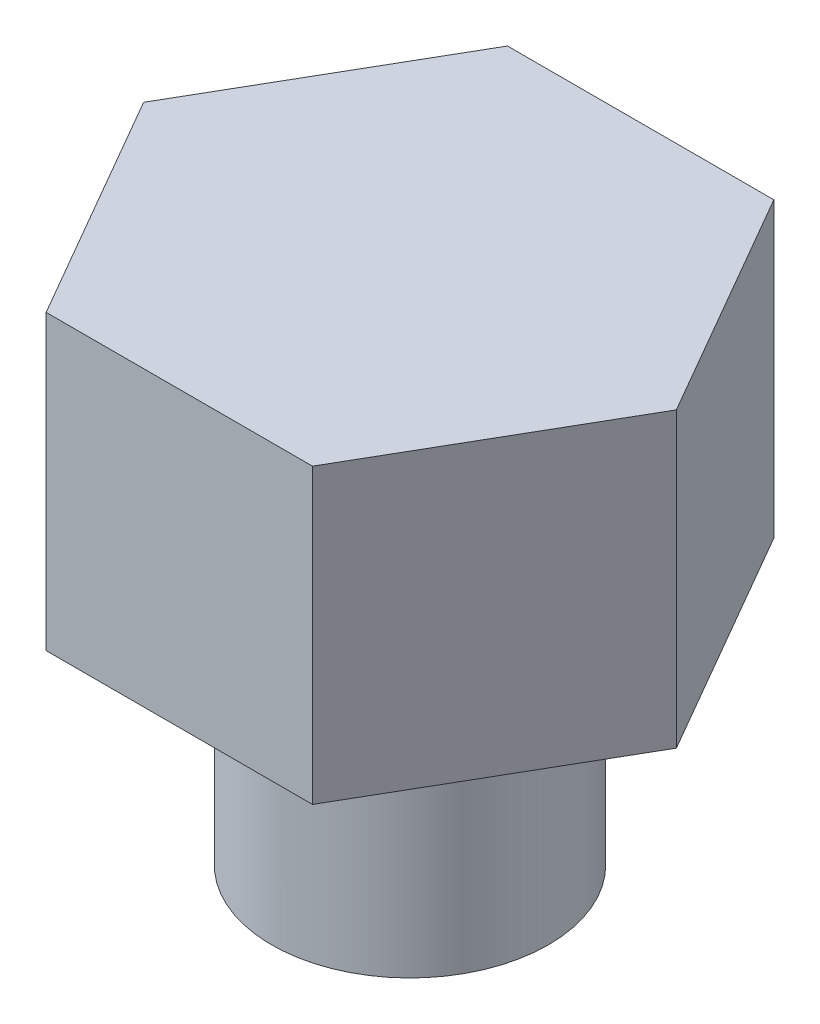
ISO-10303-21;
HEADER;
FILE_DESCRIPTION(('STEP AP214'),'2;1');
FILE_NAME('part.step','',(''),(''),'','','');
FILE_SCHEMA(('AUTOMOTIVE_DESIGN { 1 0 10303 214 1 1 1 1 }'));
ENDSEC;
DATA;
#1=APPLICATION_CONTEXT('core data for automotive mechanical design processes');
#2=APPLICATION_PROTOCOL_DEFINITION('international standard','automotive_design',2000,#1);
#3=PRODUCT_CONTEXT('',#1,'mechanical');
#4=PRODUCT('Part','Part','',(#3));
#5=PRODUCT_RELATED_PRODUCT_CATEGORY('part','',(#4));
#6=PRODUCT_DEFINITION_FORMATION('','',#4);
#7=PRODUCT_DEFINITION_CONTEXT('part definition',#1,'design');
#8=PRODUCT_DEFINITION('design','',#6,#7);
#9=PRODUCT_DEFINITION_SHAPE('','',#8);
#10=(LENGTH_UNIT() NAMED_UNIT(*) SI_UNIT(.MILLI.,.METRE.));
#11=(NAMED_UNIT(*) PLANE_ANGLE_UNIT() SI_UNIT($,.RADIAN.));
#12=(NAMED_UNIT(*) SI_UNIT($,.STERADIAN.) SOLID_ANGLE_UNIT());
#13=UNCERTAINTY_MEASURE_WITH_UNIT(LENGTH_MEASURE(1.E-05),#10,'distance_accuracy_value','');
#14=(GEOMETRIC_REPRESENTATION_CONTEXT(3) GLOBAL_UNCERTAINTY_ASSIGNED_CONTEXT((#13)) GLOBAL_UNIT_ASSIGNED_CONTEXT((#10,
#11,#12)) REPRESENTATION_CONTEXT('',''));
#15=CARTESIAN_POINT('',(0.,0.,0.));
#16=DIRECTION('',(0.,0.,1.));
#17=DIRECTION('',(1.,0.,0.));
#18=AXIS2_PLACEMENT_3D('',#15,#16,#17);
#19=CARTESIAN_POINT('',(5.77350269189626,-11.9252523165195,0.));
#20=DIRECTION('',(-0.866025403784439,0.,-0.5));
#21=DIRECTION('',(-0.5,0.,0.866025403784439));
#22=AXIS2_PLACEMENT_3D('',#19,#20,#21);
#23=PLANE('',#22);
#24=DIRECTION('',(-0.5,0.,0.866025403784439));
#25=VECTOR('',#24,1.);
#26=CARTESIAN_POINT('',(5.77350269189626,3.35,0.));
#27=LINE('',#26,#25);
#28=CARTESIAN_POINT('',(5.77350269189626,3.35,0.));
#29=VERTEX_POINT('',#28);
#30=CARTESIAN_POINT('',(2.88675134594813,3.35,5.));
#31=VERTEX_POINT('',#30);
#32=EDGE_CURVE('E288',#29,#31,#27,.T.);
#33=ORIENTED_EDGE('',*,*,#32,.F.);
#34=DIRECTION('',(0.,1.,0.));
#35=VECTOR('',#34,1.);
#36=CARTESIAN_POINT('',(5.77350269189626,-11.9252523165195,0.));
#37=LINE('',#36,#35);
#38=CARTESIAN_POINT('',(5.77350269189626,9.7,0.));
#39=VERTEX_POINT('',#38);
#40=EDGE_CURVE('E49',#29,#39,#37,.T.);
#41=ORIENTED_EDGE('',*,*,#40,.T.);
#42=DIRECTION('',(-0.5,0.,0.866025403784439));
#43=VECTOR('',#42,1.);
#44=CARTESIAN_POINT('',(5.77350269189626,9.7,0.));
#45=LINE('',#44,#43);
#46=CARTESIAN_POINT('',(2.88675134594813,9.7,5.));
#47=VERTEX_POINT('',#46);
#48=EDGE_CURVE('E260',#39,#47,#45,.T.);
#49=ORIENTED_EDGE('',*,*,#48,.T.);
#50=DIRECTION('',(0.,1.,0.));
#51=VECTOR('',#50,1.);
#52=CARTESIAN_POINT('',(2.88675134594813,-11.9252523165195,5.));
#53=LINE('',#52,#51);
#54=EDGE_CURVE('E269',#31,#47,#53,.T.);
#55=ORIENTED_EDGE('',*,*,#54,.F.);
#56=EDGE_LOOP('',(#33,#41,#49,#55));
#57=FACE_BOUND('',#56,.T.);
#58=ADVANCED_FACE('F45',(#57),#23,.F.);
#59=CARTESIAN_POINT('',(2.88675134594813,-11.9252523165195,5.));
#60=DIRECTION('',(0.,0.,-1.));
#61=DIRECTION('',(-1.,0.,0.));
#62=AXIS2_PLACEMENT_3D('',#59,#60,#61);
#63=PLANE('',#62);
#64=DIRECTION('',(-1.,0.,0.));
#65=VECTOR('',#64,1.);
#66=CARTESIAN_POINT('',(2.88675134594813,3.35,5.));
#67=LINE('',#66,#65);
#68=CARTESIAN_POINT('',(-2.88675134594813,3.35,5.));
#69=VERTEX_POINT('',#68);
#70=EDGE_CURVE('E284',#31,#69,#67,.T.);
#71=ORIENTED_EDGE('',*,*,#70,.F.);
#72=ORIENTED_EDGE('',*,*,#54,.T.);
#73=DIRECTION('',(-1.,0.,0.));
#74=VECTOR('',#73,1.);
#75=CARTESIAN_POINT('',(2.88675134594813,9.7,5.));
#76=LINE('',#75,#74);
#77=CARTESIAN_POINT('',(-2.88675134594813,9.7,5.));
#78=VERTEX_POINT('',#77);
#79=EDGE_CURVE('E266',#47,#78,#76,.T.);
#80=ORIENTED_EDGE('',*,*,#79,.T.);
#81=DIRECTION('',(0.,1.,0.));
#82=VECTOR('',#81,1.);
#83=CARTESIAN_POINT('',(-2.88675134594813,-11.9252523165195,5.));
#84=LINE('',#83,#82);
#85=EDGE_CURVE('E296',#69,#78,#84,.T.);
#86=ORIENTED_EDGE('',*,*,#85,.F.);
#87=EDGE_LOOP('',(#71,#72,#80,#86));
#88=FACE_BOUND('',#87,.T.);
#89=ADVANCED_FACE('F224',(#88),#63,.F.);
#90=CARTESIAN_POINT('',(-2.88675134594813,-11.9252523165195,5.));
#91=DIRECTION('',(0.866025403784438,0.,-0.5));
#92=DIRECTION('',(-0.5,0.,-0.866025403784439));
#93=AXIS2_PLACEMENT_3D('',#90,#91,#92);
#94=PLANE('',#93);
#95=DIRECTION('',(-0.5,0.,-0.866025403784439));
#96=VECTOR('',#95,1.);
#97=CARTESIAN_POINT('',(-2.88675134594813,3.35,5.));
#98=LINE('',#97,#96);
#99=CARTESIAN_POINT('',(-5.77350269189626,3.35,0.));
#100=VERTEX_POINT('',#99);
#101=EDGE_CURVE('E280',#69,#100,#98,.T.);
#102=ORIENTED_EDGE('',*,*,#101,.F.);
#103=ORIENTED_EDGE('',*,*,#85,.T.);
#104=DIRECTION('',(-0.5,0.,-0.866025403784439));
#105=VECTOR('',#104,1.);
#106=CARTESIAN_POINT('',(-2.88675134594813,9.7,5.));
#107=LINE('',#106,#105);
#108=CARTESIAN_POINT('',(-5.77350269189626,9.7,0.));
#109=VERTEX_POINT('',#108);
#110=EDGE_CURVE('E299',#78,#109,#107,.T.);
#111=ORIENTED_EDGE('',*,*,#110,.T.);
#112=DIRECTION('',(0.,1.,0.));
#113=VECTOR('',#112,1.);
#114=CARTESIAN_POINT('',(-5.77350269189626,-11.9252523165195,0.));
#115=LINE('',#114,#113);
#116=EDGE_CURVE('E300',#100,#109,#115,.T.);
#117=ORIENTED_EDGE('',*,*,#116,.F.);
#118=EDGE_LOOP('',(#102,#103,#111,#117));
#119=FACE_BOUND('',#118,.T.);
#120=ADVANCED_FACE('F230',(#119),#94,.F.);
#121=CARTESIAN_POINT('',(-5.77350269189626,-11.9252523165195,0.));
#122=DIRECTION('',(0.866025403784439,0.,0.5));
#123=DIRECTION('',(0.5,0.,-0.866025403784439));
#124=AXIS2_PLACEMENT_3D('',#121,#122,#123);
#125=PLANE('',#124);
#126=DIRECTION('',(0.5,0.,-0.866025403784439));
#127=VECTOR('',#126,1.);
#128=CARTESIAN_POINT('',(-5.77350269189626,3.35,0.));
#129=LINE('',#128,#127);
#130=CARTESIAN_POINT('',(-2.88675134594813,3.35,-5.));
#131=VERTEX_POINT('',#130);
#132=EDGE_CURVE('E55',#100,#131,#129,.T.);
#133=ORIENTED_EDGE('',*,*,#132,.F.);
#134=ORIENTED_EDGE('',*,*,#116,.T.);
#135=DIRECTION('',(0.5,0.,-0.866025403784439));
#136=VECTOR('',#135,1.);
#137=CARTESIAN_POINT('',(-5.77350269189626,9.7,0.));
#138=LINE('',#137,#136);
#139=CARTESIAN_POINT('',(-2.88675134594813,9.7,-5.));
#140=VERTEX_POINT('',#139);
#141=EDGE_CURVE('E303',#109,#140,#138,.T.);
#142=ORIENTED_EDGE('',*,*,#141,.T.);
#143=DIRECTION('',(0.,1.,0.));
#144=VECTOR('',#143,1.);
#145=CARTESIAN_POINT('',(-2.88675134594813,-11.9252523165195,-5.));
#146=LINE('',#145,#144);
#147=EDGE_CURVE('E304',#131,#140,#146,.T.);
#148=ORIENTED_EDGE('',*,*,#147,.F.);
#149=EDGE_LOOP('',(#133,#134,#142,#148));
#150=FACE_BOUND('',#149,.T.);
#151=ADVANCED_FACE('F237',(#150),#125,.F.);
#152=CARTESIAN_POINT('',(-2.88675134594813,-11.9252523165195,-5.));
#153=DIRECTION('',(0.,0.,1.));
#154=DIRECTION('',(1.,0.,0.));
#155=AXIS2_PLACEMENT_3D('',#152,#153,#154);
#156=PLANE('',#155);
#157=DIRECTION('',(1.,0.,0.));
#158=VECTOR('',#157,1.);
#159=CARTESIAN_POINT('',(-2.88675134594813,3.35,-5.));
#160=LINE('',#159,#158);
#161=CARTESIAN_POINT('',(2.88675134594813,3.35,-5.));
#162=VERTEX_POINT('',#161);
#163=EDGE_CURVE('E11',#131,#162,#160,.T.);
#164=ORIENTED_EDGE('',*,*,#163,.F.);
#165=ORIENTED_EDGE('',*,*,#147,.T.);
#166=DIRECTION('',(1.,0.,0.));
#167=VECTOR('',#166,1.);
#168=CARTESIAN_POINT('',(-2.88675134594813,9.7,-5.));
#169=LINE('',#168,#167);
#170=CARTESIAN_POINT('',(2.88675134594813,9.7,-5.));
#171=VERTEX_POINT('',#170);
#172=EDGE_CURVE('E306',#140,#171,#169,.T.);
#173=ORIENTED_EDGE('',*,*,#172,.T.);
#174=DIRECTION('',(0.,1.,0.));
#175=VECTOR('',#174,1.);
#176=CARTESIAN_POINT('',(2.88675134594813,-11.9252523165195,-5.));
#177=LINE('',#176,#175);
#178=EDGE_CURVE('E307',#162,#171,#177,.T.);
#179=ORIENTED_EDGE('',*,*,#178,.F.);
#180=EDGE_LOOP('',(#164,#165,#173,#179));
#181=FACE_BOUND('',#180,.T.);
#182=ADVANCED_FACE('F241',(#181),#156,.F.);
#183=CARTESIAN_POINT('',(2.88675134594813,-11.9252523165195,-5.));
#184=DIRECTION('',(-0.866025403784438,0.,0.5));
#185=DIRECTION('',(0.5,0.,0.866025403784438));
#186=AXIS2_PLACEMENT_3D('',#183,#184,#185);
#187=PLANE('',#186);
#188=DIRECTION('',(0.5,0.,0.866025403784438));
#189=VECTOR('',#188,1.);
#190=CARTESIAN_POINT('',(2.88675134594813,3.35,-5.));
#191=LINE('',#190,#189);
#192=EDGE_CURVE('E292',#162,#29,#191,.T.);
#193=ORIENTED_EDGE('',*,*,#192,.F.);
#194=ORIENTED_EDGE('',*,*,#178,.T.);
#195=DIRECTION('',(0.5,0.,0.866025403784438));
#196=VECTOR('',#195,1.);
#197=CARTESIAN_POINT('',(2.88675134594813,9.7,-5.));
#198=LINE('',#197,#196);
#199=EDGE_CURVE('E263',#171,#39,#198,.T.);
#200=ORIENTED_EDGE('',*,*,#199,.T.);
#201=ORIENTED_EDGE('',*,*,#40,.F.);
#202=EDGE_LOOP('',(#193,#194,#200,#201));
#203=FACE_BOUND('',#202,.T.);
#204=ADVANCED_FACE('F245',(#203),#187,.F.);
#205=CARTESIAN_POINT('',(0.,9.7,0.));
#206=DIRECTION('',(0.,-1.,0.));
#207=DIRECTION('',(0.,0.,-1.));
#208=AXIS2_PLACEMENT_3D('',#205,#206,#207);
#209=PLANE('',#208);
#210=ORIENTED_EDGE('',*,*,#48,.F.);
#211=ORIENTED_EDGE('',*,*,#199,.F.);
#212=ORIENTED_EDGE('',*,*,#172,.F.);
#213=ORIENTED_EDGE('',*,*,#141,.F.);
#214=ORIENTED_EDGE('',*,*,#110,.F.);
#215=ORIENTED_EDGE('',*,*,#79,.F.);
#216=EDGE_LOOP('',(#210,#211,#212,#213,#214,#215));
#217=FACE_BOUND('',#216,.T.);
#218=ADVANCED_FACE('F248',(#217),#209,.F.);
#219=CARTESIAN_POINT('',(0.,3.35,0.));
#220=DIRECTION('',(0.,-1.,0.));
#221=DIRECTION('',(1.,0.,0.));
#222=AXIS2_PLACEMENT_3D('',#219,#220,#221);
#223=PLANE('',#222);
#224=DIRECTION('',(1.,0.,0.));
#225=VECTOR('',#224,1.);
#226=CARTESIAN_POINT('',(-19.,3.35,0.442499999999999));
#227=LINE('',#226,#225);
#228=CARTESIAN_POINT('',(-2.96718616706131,3.35,0.442499999999999));
#229=VERTEX_POINT('',#228);
#230=CARTESIAN_POINT('',(0.,3.35,0.442499999999999));
#231=VERTEX_POINT('',#230);
#232=EDGE_CURVE('E63',#229,#231,#227,.T.);
#233=ORIENTED_EDGE('',*,*,#232,.F.);
#234=CARTESIAN_POINT('',(0.,3.35,0.));
#235=DIRECTION('',(0.,-1.,0.));
#236=DIRECTION('',(1.,0.,0.));
#237=AXIS2_PLACEMENT_3D('',#234,#235,#236);
#238=CIRCLE('',#237,3.);
#239=CARTESIAN_POINT('',(-2.96718616706131,3.35,-0.442499999999999));
#240=VERTEX_POINT('',#239);
#241=EDGE_CURVE('E68',#240,#229,#238,.T.);
#242=ORIENTED_EDGE('',*,*,#241,.F.);
#243=DIRECTION('',(1.,0.,0.));
#244=VECTOR('',#243,1.);
#245=CARTESIAN_POINT('',(-19.,3.35,-0.442499999999999));
#246=LINE('',#245,#244);
#247=CARTESIAN_POINT('',(0.,3.35,-0.442499999999999));
#248=VERTEX_POINT('',#247);
#249=EDGE_CURVE('E331',#240,#248,#246,.T.);
#250=ORIENTED_EDGE('',*,*,#249,.T.);
#251=DIRECTION('',(0.,0.,1.));
#252=VECTOR('',#251,1.);
#253=CARTESIAN_POINT('',(0.,3.35,0.442499999999999));
#254=LINE('',#253,#252);
#255=EDGE_CURVE('E168',#248,#231,#254,.T.);
#256=ORIENTED_EDGE('',*,*,#255,.T.);
#257=EDGE_LOOP('',(#233,#242,#250,#256));
#258=FACE_BOUND('',#257,.T.);
#259=ORIENTED_EDGE('',*,*,#192,.T.);
#260=ORIENTED_EDGE('',*,*,#32,.T.);
#261=ORIENTED_EDGE('',*,*,#70,.T.);
#262=ORIENTED_EDGE('',*,*,#101,.T.);
#263=ORIENTED_EDGE('',*,*,#132,.T.);
#264=ORIENTED_EDGE('',*,*,#163,.T.);
#265=EDGE_LOOP('',(#259,#260,#261,#262,#263,#264));
#266=FACE_BOUND('',#265,.T.);
#267=ADVANCED_FACE('F47',(#258,#266),#223,.T.);
#268=CARTESIAN_POINT('',(0.,-1.73,0.));
#269=DIRECTION('',(0.,1.,0.));
#270=DIRECTION('',(-1.,0.,0.));
#271=AXIS2_PLACEMENT_3D('',#268,#269,#270);
#272=CYLINDRICAL_SURFACE('',#271,3.);
#273=CARTESIAN_POINT('',(-2.96718616706131,3.35,0.442499999999999));
#274=CARTESIAN_POINT('',(-2.96070204550577,3.35000685866342,0.486038006081617));
#275=CARTESIAN_POINT('',(-2.95324456139571,3.3482092932581,0.529419176712419));
#276=CARTESIAN_POINT('',(-2.93650416418267,3.34113305231065,0.615508755971131));
#277=CARTESIAN_POINT('',(-2.92722260810017,3.33585695779465,0.658217639389615));
#278=CARTESIAN_POINT('',(-2.90700742376186,3.3219935629478,0.742410779362829));
#279=CARTESIAN_POINT('',(-2.89608424789408,3.31342671347418,0.783900928641106));
#280=CARTESIAN_POINT('',(-2.87270772984776,3.29314386227103,0.865656320587151));
#281=CARTESIAN_POINT('',(-2.86025414608379,3.28142736300006,0.90592136860945));
#282=CARTESIAN_POINT('',(-2.82093735194693,3.24187927235071,1.0243001750564));
#283=CARTESIAN_POINT('',(-2.79204293205182,3.20959684725037,1.10030375287973));
#284=CARTESIAN_POINT('',(-2.73046930884084,3.13449178362819,1.24530035681876));
#285=CARTESIAN_POINT('',(-2.69778373642742,3.09165126777903,1.31428120892335));
#286=CARTESIAN_POINT('',(-2.62688540971764,2.99155905851607,1.45121265920016));
#287=CARTESIAN_POINT('',(-2.58845326475647,2.93326409272009,1.51828760676407));
#288=CARTESIAN_POINT('',(-2.51182600273553,2.80620719488311,1.64195785783998));
#289=CARTESIAN_POINT('',(-2.47363108494712,2.73743744955257,1.69854526811364));
#290=CARTESIAN_POINT('',(-2.40441724139996,2.5976254600805,1.7949750686317));
#291=CARTESIAN_POINT('',(-2.37306336034958,2.52751992673469,1.83593331161061));
#292=CARTESIAN_POINT('',(-2.31617258220222,2.38011689909019,1.9072025735863));
#293=CARTESIAN_POINT('',(-2.29061221960124,2.30285027004344,1.93755682278021));
#294=CARTESIAN_POINT('',(-2.26010187647551,2.18631358999412,1.97285356866457));
#295=CARTESIAN_POINT('',(-2.25152869173566,2.1493958903316,1.9826110769095));
#296=CARTESIAN_POINT('',(-2.23654028554197,2.07453616616452,1.99950354510478));
#297=CARTESIAN_POINT('',(-2.23012427132727,2.03659452350911,2.00663946857794));
#298=CARTESIAN_POINT('',(-2.21965918381207,1.95953123701959,2.01821174592897));
#299=CARTESIAN_POINT('',(-2.21563751499213,1.92040112479908,2.02261686708945));
#300=CARTESIAN_POINT('',(-2.2102296379146,1.84168576225804,2.02851876480045));
#301=CARTESIAN_POINT('',(-2.20884729822325,1.80209992927277,2.03001127229167));
#302=CARTESIAN_POINT('',(-2.20886848861584,1.7625,2.03));
#303=B_SPLINE_CURVE_WITH_KNOTS('',3,(#273,#274,#275,#276,#277,#278,#279,#280,#281,#282,#283,
#284,#285,#286,#287,#288,#289,#290,#291,#292,#293,#294,#295,#296,#297,#298,#299,#300,#301,#302),
.UNSPECIFIED.,.F.,.F.,(4,2,2,2,2,2,2,2,2,2,2,2,2,2,4),(0.,0.131989189028418,0.263880553740803,
0.394965186172296,0.526070537860069,0.787334360495563,1.04904364068557,1.33834955594296,
1.62787233512609,1.88805193735348,2.14715811377424,2.26443522416481,2.38166918794879,
2.50022037039429,2.61894518487212),.UNSPECIFIED.);
#304=CARTESIAN_POINT('',(-2.20886848861584,1.7625,2.03));
#305=VERTEX_POINT('',#304);
#306=EDGE_CURVE('E194',#229,#305,#303,.T.);
#307=ORIENTED_EDGE('',*,*,#306,.T.);
#308=DIRECTION('',(0.,1.,0.));
#309=VECTOR('',#308,1.);
#310=CARTESIAN_POINT('',(-2.20886848861584,-1.73,2.03));
#311=LINE('',#310,#309);
#312=CARTESIAN_POINT('',(-2.20886848861583,-1.73,2.03));
#313=VERTEX_POINT('',#312);
#314=EDGE_CURVE('E337',#305,#313,#311,.F.);
#315=ORIENTED_EDGE('',*,*,#314,.T.);
#316=CARTESIAN_POINT('',(0.,-1.73,0.));
#317=DIRECTION('',(0.,-1.,0.));
#318=DIRECTION('',(1.,0.,0.));
#319=AXIS2_PLACEMENT_3D('',#316,#317,#318);
#320=CIRCLE('',#319,3.);
#321=CARTESIAN_POINT('',(-2.20886848861583,-1.73,-2.03));
#322=VERTEX_POINT('',#321);
#323=EDGE_CURVE('E334',#322,#313,#320,.T.);
#324=ORIENTED_EDGE('',*,*,#323,.F.);
#325=DIRECTION('',(0.,1.,0.));
#326=VECTOR('',#325,1.);
#327=CARTESIAN_POINT('',(-2.20886848861584,-1.73,-2.03));
#328=LINE('',#327,#326);
#329=CARTESIAN_POINT('',(-2.20886848861583,1.7625,-2.03));
#330=VERTEX_POINT('',#329);
#331=EDGE_CURVE('E142',#322,#330,#328,.T.);
#332=ORIENTED_EDGE('',*,*,#331,.T.);
#333=CARTESIAN_POINT('',(-2.20886848861584,1.7625,-2.03));
#334=CARTESIAN_POINT('',(-2.20884965147427,1.80087672843737,-2.03001005019795));
#335=CARTESIAN_POINT('',(-2.21014686324842,1.83924138601534,-2.02860883789166));
#336=CARTESIAN_POINT('',(-2.21522855851989,1.91555962112654,-2.02306394609819));
#337=CARTESIAN_POINT('',(-2.21900993727852,1.95351365175769,-2.01892368985234));
#338=CARTESIAN_POINT('',(-2.22886722691267,2.02835232724279,-2.00803407080227));
#339=CARTESIAN_POINT('',(-2.23492027013549,2.06524380945369,-2.00131069540092));
#340=CARTESIAN_POINT('',(-2.24908228011896,2.13808169382436,-1.98538231204534));
#341=CARTESIAN_POINT('',(-2.25719178783383,2.17402784456385,-1.97617665108395));
#342=CARTESIAN_POINT('',(-2.28410716227762,2.27977747953413,-1.94514817824049));
#343=CARTESIAN_POINT('',(-2.30556161903303,2.34791991872198,-1.91984919251246));
#344=CARTESIAN_POINT('',(-2.35330571671136,2.47884025265833,-1.8610177896215));
#345=CARTESIAN_POINT('',(-2.3796083285103,2.54160307855658,-1.82746320260892));
#346=CARTESIAN_POINT('',(-2.43907091177347,2.67005610512813,-1.74750195988944));
#347=CARTESIAN_POINT('',(-2.47267037060838,2.73481736495272,-1.69993055124471));
#348=CARTESIAN_POINT('',(-2.54101917250553,2.85614855656921,-1.5959634357421));
#349=CARTESIAN_POINT('',(-2.57576925090955,2.91271312082924,-1.53956199645261));
#350=CARTESIAN_POINT('',(-2.65116654220267,3.02741962078816,-1.40650878437713));
#351=CARTESIAN_POINT('',(-2.69161010823844,3.0836326995246,-1.32806103714586));
#352=CARTESIAN_POINT('',(-2.76790445940744,3.18157246152383,-1.1606536604309));
#353=CARTESIAN_POINT('',(-2.80376398783574,3.22332699023423,-1.07171468392329));
#354=CARTESIAN_POINT('',(-2.85035080269894,3.27176145553006,-0.93673833549664));
#355=CARTESIAN_POINT('',(-2.86405003038632,3.28509918107061,-0.894021724100861));
#356=CARTESIAN_POINT('',(-2.88973838766129,3.30820989251379,-0.807130486311653));
#357=CARTESIAN_POINT('',(-2.90172798989313,3.31798386482216,-0.762956267064419));
#358=CARTESIAN_POINT('',(-2.92386449896942,3.33381636990085,-0.673174713906652));
#359=CARTESIAN_POINT('',(-2.93399881165964,3.33985012777295,-0.627559883958741));
#360=CARTESIAN_POINT('',(-2.95219133135635,3.34794831801083,-0.53552465208303));
#361=CARTESIAN_POINT('',(-2.9602474515397,3.35000877390983,-0.489103489999374));
#362=CARTESIAN_POINT('',(-2.96718616706131,3.35,-0.442499999999999));
#363=B_SPLINE_CURVE_WITH_KNOTS('',3,(#333,#334,#335,#336,#337,#338,#339,#340,#341,#342,#343,
#344,#345,#346,#347,#348,#349,#350,#351,#352,#353,#354,#355,#356,#357,#358,#359,#360,#361,#362),
.UNSPECIFIED.,.F.,.F.,(4,2,2,2,2,2,2,2,2,2,2,2,2,2,4),(0.,0.115063233563034,0.229982932745643,
0.343775541975008,0.457598115526542,0.683949217326959,0.910914934160598,1.17128877180723,
1.43183234977989,1.74425819455457,2.05607895346872,2.19632678179084,2.33653576161233,
2.47766381945945,2.61893304462258),.UNSPECIFIED.);
#364=EDGE_CURVE('E182',#330,#240,#363,.T.);
#365=ORIENTED_EDGE('',*,*,#364,.T.);
#366=ORIENTED_EDGE('',*,*,#241,.T.);
#367=EDGE_LOOP('',(#307,#315,#324,#332,#365,#366));
#368=FACE_BOUND('',#367,.T.);
#369=ADVANCED_FACE('F201',(#368),#272,.T.);
#370=CARTESIAN_POINT('',(0.,-1.73,0.));
#371=DIRECTION('',(0.,-1.,0.));
#372=DIRECTION('',(1.,0.,0.));
#373=AXIS2_PLACEMENT_3D('',#370,#371,#372);
#374=PLANE('',#373);
#375=DIRECTION('',(-1.,0.,0.));
#376=VECTOR('',#375,1.);
#377=CARTESIAN_POINT('',(0.,-1.73,2.03));
#378=LINE('',#377,#376);
#379=CARTESIAN_POINT('',(0.,-1.73,2.03));
#380=VERTEX_POINT('',#379);
#381=EDGE_CURVE('E148',#380,#313,#378,.T.);
#382=ORIENTED_EDGE('',*,*,#381,.F.);
#383=DIRECTION('',(0.,0.,-1.));
#384=VECTOR('',#383,1.);
#385=CARTESIAN_POINT('',(0.,-1.73,-2.03));
#386=LINE('',#385,#384);
#387=CARTESIAN_POINT('',(0.,-1.73,-2.03));
#388=VERTEX_POINT('',#387);
#389=EDGE_CURVE('E154',#380,#388,#386,.T.);
#390=ORIENTED_EDGE('',*,*,#389,.T.);
#391=DIRECTION('',(1.,0.,0.));
#392=VECTOR('',#391,1.);
#393=CARTESIAN_POINT('',(0.,-1.73,-2.03));
#394=LINE('',#393,#392);
#395=EDGE_CURVE('E136',#322,#388,#394,.T.);
#396=ORIENTED_EDGE('',*,*,#395,.F.);
#397=ORIENTED_EDGE('',*,*,#323,.T.);
#398=EDGE_LOOP('',(#382,#390,#396,#397));
#399=FACE_BOUND('',#398,.T.);
#400=ADVANCED_FACE('F162',(#399),#374,.T.);
#401=CARTESIAN_POINT('',(-19.,-1.73,2.03));
#402=DIRECTION('',(0.,0.,1.));
#403=DIRECTION('',(1.,0.,0.));
#404=AXIS2_PLACEMENT_3D('',#401,#402,#403);
#405=PLANE('',#404);
#406=DIRECTION('',(1.,0.,0.));
#407=VECTOR('',#406,1.);
#408=CARTESIAN_POINT('',(-19.,1.7625,2.03));
#409=LINE('',#408,#407);
#410=CARTESIAN_POINT('',(0.,1.7625,2.03));
#411=VERTEX_POINT('',#410);
#412=EDGE_CURVE('E179',#305,#411,#409,.T.);
#413=ORIENTED_EDGE('',*,*,#412,.T.);
#414=DIRECTION('',(0.,-1.,0.));
#415=VECTOR('',#414,1.);
#416=CARTESIAN_POINT('',(0.,-1.73,2.03));
#417=LINE('',#416,#415);
#418=EDGE_CURVE('E175',#411,#380,#417,.T.);
#419=ORIENTED_EDGE('',*,*,#418,.T.);
#420=ORIENTED_EDGE('',*,*,#381,.T.);
#421=ORIENTED_EDGE('',*,*,#314,.F.);
#422=EDGE_LOOP('',(#413,#419,#420,#421));
#423=FACE_BOUND('',#422,.T.);
#424=ADVANCED_FACE('F214',(#423),#405,.F.);
#425=CARTESIAN_POINT('',(-19.,-1.73,-2.03));
#426=DIRECTION('',(0.,0.,-1.));
#427=DIRECTION('',(0.,1.,0.));
#428=AXIS2_PLACEMENT_3D('',#425,#426,#427);
#429=PLANE('',#428);
#430=ORIENTED_EDGE('',*,*,#395,.T.);
#431=DIRECTION('',(0.,1.,0.));
#432=VECTOR('',#431,1.);
#433=CARTESIAN_POINT('',(0.,-1.73,-2.03));
#434=LINE('',#433,#432);
#435=CARTESIAN_POINT('',(0.,1.7625,-2.03));
#436=VERTEX_POINT('',#435);
#437=EDGE_CURVE('E140',#388,#436,#434,.T.);
#438=ORIENTED_EDGE('',*,*,#437,.T.);
#439=DIRECTION('',(1.,0.,0.));
#440=VECTOR('',#439,1.);
#441=CARTESIAN_POINT('',(-19.,1.7625,-2.03));
#442=LINE('',#441,#440);
#443=EDGE_CURVE('E178',#330,#436,#442,.T.);
#444=ORIENTED_EDGE('',*,*,#443,.F.);
#445=ORIENTED_EDGE('',*,*,#331,.F.);
#446=EDGE_LOOP('',(#430,#438,#444,#445));
#447=FACE_BOUND('',#446,.T.);
#448=ADVANCED_FACE('F138',(#447),#429,.F.);
#449=CARTESIAN_POINT('',(-19.,1.7625,0.442499999999999));
#450=DIRECTION('',(1.,0.,0.));
#451=DIRECTION('',(0.,0.,-1.));
#452=AXIS2_PLACEMENT_3D('',#449,#450,#451);
#453=CYLINDRICAL_SURFACE('',#452,1.5875);
#454=ORIENTED_EDGE('',*,*,#232,.T.);
#455=CARTESIAN_POINT('',(0.,1.7625,0.442499999999999));
#456=DIRECTION('',(1.,0.,0.));
#457=DIRECTION('',(0.,0.,1.));
#458=AXIS2_PLACEMENT_3D('',#455,#456,#457);
#459=CIRCLE('',#458,1.5875);
#460=EDGE_CURVE('E171',#231,#411,#459,.T.);
#461=ORIENTED_EDGE('',*,*,#460,.T.);
#462=ORIENTED_EDGE('',*,*,#412,.F.);
#463=ORIENTED_EDGE('',*,*,#306,.F.);
#464=EDGE_LOOP('',(#454,#461,#462,#463));
#465=FACE_BOUND('',#464,.T.);
#466=ADVANCED_FACE('F209',(#465),#453,.F.);
#467=CARTESIAN_POINT('',(-19.,1.7625,-0.442499999999999));
#468=DIRECTION('',(1.,0.,0.));
#469=DIRECTION('',(0.,0.,-1.));
#470=AXIS2_PLACEMENT_3D('',#467,#468,#469);
#471=CYLINDRICAL_SURFACE('',#470,1.5875);
#472=ORIENTED_EDGE('',*,*,#443,.T.);
#473=CARTESIAN_POINT('',(0.,1.7625,-0.442499999999999));
#474=DIRECTION('',(1.,0.,0.));
#475=DIRECTION('',(0.,0.,-1.));
#476=AXIS2_PLACEMENT_3D('',#473,#474,#475);
#477=CIRCLE('',#476,1.5875);
#478=EDGE_CURVE('E158',#436,#248,#477,.T.);
#479=ORIENTED_EDGE('',*,*,#478,.T.);
#480=ORIENTED_EDGE('',*,*,#249,.F.);
#481=ORIENTED_EDGE('',*,*,#364,.F.);
#482=EDGE_LOOP('',(#472,#479,#480,#481));
#483=FACE_BOUND('',#482,.T.);
#484=ADVANCED_FACE('F205',(#483),#471,.F.);
#485=CARTESIAN_POINT('',(0.,1.7625,0.442499999999999));
#486=DIRECTION('',(-1.,0.,0.));
#487=DIRECTION('',(0.,0.,1.));
#488=AXIS2_PLACEMENT_3D('',#485,#486,#487);
#489=PLANE('',#488);
#490=ORIENTED_EDGE('',*,*,#418,.F.);
#491=ORIENTED_EDGE('',*,*,#460,.F.);
#492=ORIENTED_EDGE('',*,*,#255,.F.);
#493=ORIENTED_EDGE('',*,*,#478,.F.);
#494=ORIENTED_EDGE('',*,*,#437,.F.);
#495=ORIENTED_EDGE('',*,*,#389,.F.);
#496=EDGE_LOOP('',(#490,#491,#492,#493,#494,#495));
#497=FACE_BOUND('',#496,.T.);
#498=ADVANCED_FACE('F153',(#497),#489,.T.);
#499=CLOSED_SHELL('',(#58,#89,#120,#151,#182,#204,#218,#267,#369,#400,#424,#448,#466,#484,#498));
#500=MANIFOLD_SOLID_BREP('B2',#499);
#501=ADVANCED_BREP_SHAPE_REPRESENTATION('',(#18,#500),#14);
#502=SHAPE_DEFINITION_REPRESENTATION(#9,#501);
ENDSEC;
END-ISO-10303-21;
